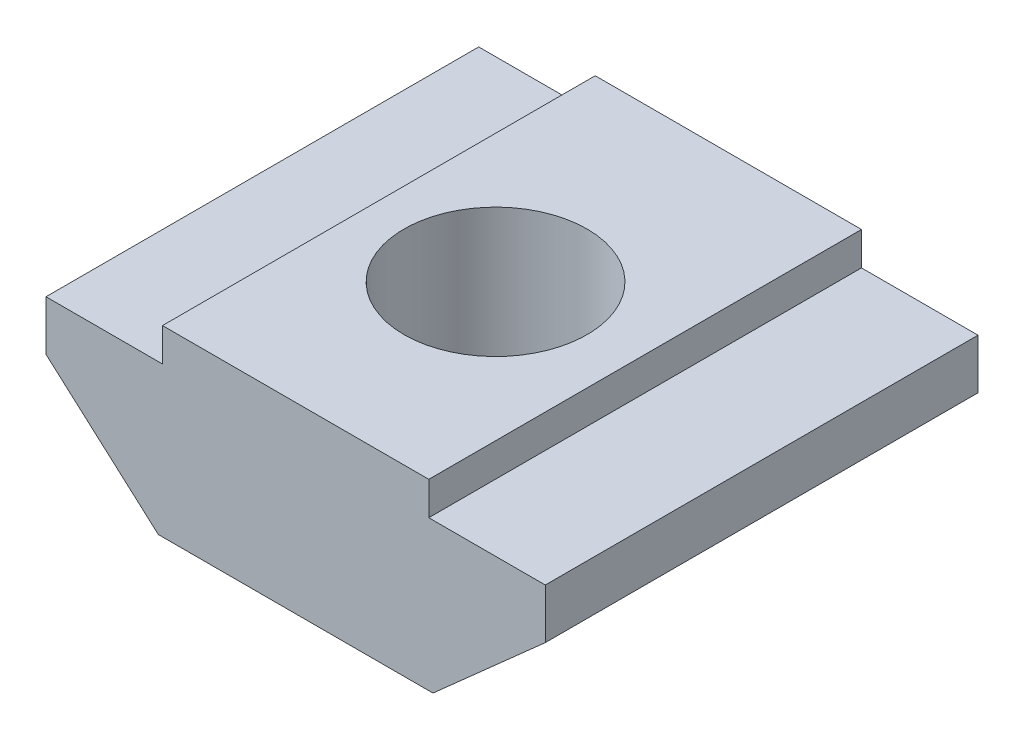
ISO-10303-21;
HEADER;
FILE_DESCRIPTION(('STEP AP214'),'2;1');
FILE_NAME('part.step','',(''),(''),'','','');
FILE_SCHEMA(('AUTOMOTIVE_DESIGN { 1 0 10303 214 1 1 1 1 }'));
ENDSEC;
DATA;
#1=APPLICATION_CONTEXT('core data for automotive mechanical design processes');
#2=APPLICATION_PROTOCOL_DEFINITION('international standard','automotive_design',2000,#1);
#3=PRODUCT_CONTEXT('',#1,'mechanical');
#4=PRODUCT('Part','Part','',(#3));
#5=PRODUCT_RELATED_PRODUCT_CATEGORY('part','',(#4));
#6=PRODUCT_DEFINITION_FORMATION('','',#4);
#7=PRODUCT_DEFINITION_CONTEXT('part definition',#1,'design');
#8=PRODUCT_DEFINITION('design','',#6,#7);
#9=PRODUCT_DEFINITION_SHAPE('','',#8);
#10=(LENGTH_UNIT() NAMED_UNIT(*) SI_UNIT(.MILLI.,.METRE.));
#11=(NAMED_UNIT(*) PLANE_ANGLE_UNIT() SI_UNIT($,.RADIAN.));
#12=(NAMED_UNIT(*) SI_UNIT($,.STERADIAN.) SOLID_ANGLE_UNIT());
#13=UNCERTAINTY_MEASURE_WITH_UNIT(LENGTH_MEASURE(1.E-05),#10,'distance_accuracy_value','');
#14=(GEOMETRIC_REPRESENTATION_CONTEXT(3) GLOBAL_UNCERTAINTY_ASSIGNED_CONTEXT((#13)) GLOBAL_UNIT_ASSIGNED_CONTEXT((#10,
#11,#12)) REPRESENTATION_CONTEXT('',''));
#15=CARTESIAN_POINT('',(0.,0.,0.));
#16=DIRECTION('',(0.,0.,1.));
#17=DIRECTION('',(1.,0.,0.));
#18=AXIS2_PLACEMENT_3D('',#15,#16,#17);
#19=CARTESIAN_POINT('',(-4.33688549496153,5.5,13.));
#20=DIRECTION('',(0.,-1.,0.));
#21=DIRECTION('',(0.,0.,-1.));
#22=AXIS2_PLACEMENT_3D('',#19,#20,#21);
#23=PLANE('',#22);
#24=DIRECTION('',(-1.,0.,0.));
#25=VECTOR('',#24,1.);
#26=CARTESIAN_POINT('',(-4.33688549496153,5.5,0.));
#27=LINE('',#26,#25);
#28=CARTESIAN_POINT('',(3.66311450503847,5.5,0.));
#29=VERTEX_POINT('',#28);
#30=CARTESIAN_POINT('',(-4.33688549496153,5.5,0.));
#31=VERTEX_POINT('',#30);
#32=EDGE_CURVE('E173',#29,#31,#27,.T.);
#33=ORIENTED_EDGE('',*,*,#32,.T.);
#34=DIRECTION('',(0.,0.,-1.));
#35=VECTOR('',#34,1.);
#36=CARTESIAN_POINT('',(-4.33688549496153,5.5,13.));
#37=LINE('',#36,#35);
#38=CARTESIAN_POINT('',(-4.33688549496153,5.5,13.));
#39=VERTEX_POINT('',#38);
#40=EDGE_CURVE('E142',#39,#31,#37,.T.);
#41=ORIENTED_EDGE('',*,*,#40,.F.);
#42=DIRECTION('',(-1.,0.,0.));
#43=VECTOR('',#42,1.);
#44=CARTESIAN_POINT('',(-4.33688549496153,5.5,13.));
#45=LINE('',#44,#43);
#46=CARTESIAN_POINT('',(3.66311450503847,5.5,13.));
#47=VERTEX_POINT('',#46);
#48=EDGE_CURVE('E131',#47,#39,#45,.T.);
#49=ORIENTED_EDGE('',*,*,#48,.F.);
#50=DIRECTION('',(0.,0.,-1.));
#51=VECTOR('',#50,1.);
#52=CARTESIAN_POINT('',(3.66311450503847,5.5,13.));
#53=LINE('',#52,#51);
#54=EDGE_CURVE('E189',#47,#29,#53,.T.);
#55=ORIENTED_EDGE('',*,*,#54,.T.);
#56=EDGE_LOOP('',(#33,#41,#49,#55));
#57=FACE_BOUND('',#56,.T.);
#58=CARTESIAN_POINT('',(-0.471799647864915,5.5,6.85919347099833));
#59=DIRECTION('',(0.,1.,0.));
#60=DIRECTION('',(0.,0.,1.));
#61=AXIS2_PLACEMENT_3D('',#58,#59,#60);
#62=CIRCLE('',#61,2.75);
#63=CARTESIAN_POINT('',(-0.471799647864915,5.5,9.60919347099833));
#64=VERTEX_POINT('',#63);
#65=EDGE_CURVE('E247',#64,#64,#62,.T.);
#66=ORIENTED_EDGE('',*,*,#65,.F.);
#67=EDGE_LOOP('',(#66));
#68=FACE_BOUND('',#67,.T.);
#69=ADVANCED_FACE('F39',(#57,#68),#23,.F.);
#70=CARTESIAN_POINT('',(-4.46188549496153,0.,13.));
#71=DIRECTION('',(0.66436383882992,0.74740931868366,0.));
#72=DIRECTION('',(-0.74740931868366,0.66436383882992,0.));
#73=AXIS2_PLACEMENT_3D('',#70,#71,#72);
#74=PLANE('',#73);
#75=DIRECTION('',(0.74740931868366,-0.66436383882992,0.));
#76=VECTOR('',#75,1.);
#77=CARTESIAN_POINT('',(-4.46188549496153,0.,0.));
#78=LINE('',#77,#76);
#79=CARTESIAN_POINT('',(-7.83688549496153,3.,0.));
#80=VERTEX_POINT('',#79);
#81=CARTESIAN_POINT('',(-4.46188549496153,0.,0.));
#82=VERTEX_POINT('',#81);
#83=EDGE_CURVE('E153',#80,#82,#78,.T.);
#84=ORIENTED_EDGE('',*,*,#83,.T.);
#85=DIRECTION('',(0.,0.,-1.));
#86=VECTOR('',#85,1.);
#87=CARTESIAN_POINT('',(-4.46188549496153,0.,13.));
#88=LINE('',#87,#86);
#89=CARTESIAN_POINT('',(-4.46188549496153,0.,13.));
#90=VERTEX_POINT('',#89);
#91=EDGE_CURVE('E11',#90,#82,#88,.T.);
#92=ORIENTED_EDGE('',*,*,#91,.F.);
#93=DIRECTION('',(0.74740931868366,-0.66436383882992,0.));
#94=VECTOR('',#93,1.);
#95=CARTESIAN_POINT('',(-4.46188549496153,0.,13.));
#96=LINE('',#95,#94);
#97=CARTESIAN_POINT('',(-7.83688549496153,3.,13.));
#98=VERTEX_POINT('',#97);
#99=EDGE_CURVE('E182',#98,#90,#96,.T.);
#100=ORIENTED_EDGE('',*,*,#99,.F.);
#101=DIRECTION('',(0.,0.,-1.));
#102=VECTOR('',#101,1.);
#103=CARTESIAN_POINT('',(-7.83688549496153,3.,13.));
#104=LINE('',#103,#102);
#105=EDGE_CURVE('E149',#98,#80,#104,.T.);
#106=ORIENTED_EDGE('',*,*,#105,.T.);
#107=EDGE_LOOP('',(#84,#92,#100,#106));
#108=FACE_BOUND('',#107,.T.);
#109=ADVANCED_FACE('F41',(#108),#74,.F.);
#110=CARTESIAN_POINT('',(-4.46188549496153,0.,13.));
#111=DIRECTION('',(0.,1.,0.));
#112=DIRECTION('',(0.,0.,1.));
#113=AXIS2_PLACEMENT_3D('',#110,#111,#112);
#114=PLANE('',#113);
#115=CARTESIAN_POINT('',(-0.471799647864915,0.,6.85919347099833));
#116=DIRECTION('',(0.,1.,0.));
#117=DIRECTION('',(0.,0.,1.));
#118=AXIS2_PLACEMENT_3D('',#115,#116,#117);
#119=CIRCLE('',#118,2.75);
#120=CARTESIAN_POINT('',(-0.471799647864915,0.,9.60919347099833));
#121=VERTEX_POINT('',#120);
#122=EDGE_CURVE('E158',#121,#121,#119,.T.);
#123=ORIENTED_EDGE('',*,*,#122,.T.);
#124=EDGE_LOOP('',(#123));
#125=FACE_BOUND('',#124,.T.);
#126=DIRECTION('',(1.,0.,0.));
#127=VECTOR('',#126,1.);
#128=CARTESIAN_POINT('',(-4.46188549496153,0.,0.));
#129=LINE('',#128,#127);
#130=CARTESIAN_POINT('',(3.78811450503847,0.,0.));
#131=VERTEX_POINT('',#130);
#132=EDGE_CURVE('E157',#82,#131,#129,.T.);
#133=ORIENTED_EDGE('',*,*,#132,.T.);
#134=DIRECTION('',(0.,0.,-1.));
#135=VECTOR('',#134,1.);
#136=CARTESIAN_POINT('',(3.78811450503847,0.,13.));
#137=LINE('',#136,#135);
#138=CARTESIAN_POINT('',(3.78811450503847,0.,13.));
#139=VERTEX_POINT('',#138);
#140=EDGE_CURVE('E49',#139,#131,#137,.T.);
#141=ORIENTED_EDGE('',*,*,#140,.F.);
#142=DIRECTION('',(1.,0.,0.));
#143=VECTOR('',#142,1.);
#144=CARTESIAN_POINT('',(-4.46188549496153,0.,13.));
#145=LINE('',#144,#143);
#146=EDGE_CURVE('E106',#90,#139,#145,.T.);
#147=ORIENTED_EDGE('',*,*,#146,.F.);
#148=ORIENTED_EDGE('',*,*,#91,.T.);
#149=EDGE_LOOP('',(#133,#141,#147,#148));
#150=FACE_BOUND('',#149,.T.);
#151=ADVANCED_FACE('F260',(#125,#150),#114,.F.);
#152=CARTESIAN_POINT('',(3.78811450503847,0.,13.));
#153=DIRECTION('',(-0.66436383882992,0.74740931868366,0.));
#154=DIRECTION('',(-0.74740931868366,-0.66436383882992,0.));
#155=AXIS2_PLACEMENT_3D('',#152,#153,#154);
#156=PLANE('',#155);
#157=DIRECTION('',(0.74740931868366,0.664363838829919,0.));
#158=VECTOR('',#157,1.);
#159=CARTESIAN_POINT('',(3.78811450503847,0.,0.));
#160=LINE('',#159,#158);
#161=CARTESIAN_POINT('',(7.16311450503847,3.,0.));
#162=VERTEX_POINT('',#161);
#163=EDGE_CURVE('E161',#131,#162,#160,.T.);
#164=ORIENTED_EDGE('',*,*,#163,.T.);
#165=DIRECTION('',(0.,0.,-1.));
#166=VECTOR('',#165,1.);
#167=CARTESIAN_POINT('',(7.16311450503847,3.,13.));
#168=LINE('',#167,#166);
#169=CARTESIAN_POINT('',(7.16311450503847,3.,13.));
#170=VERTEX_POINT('',#169);
#171=EDGE_CURVE('E201',#170,#162,#168,.T.);
#172=ORIENTED_EDGE('',*,*,#171,.F.);
#173=DIRECTION('',(0.74740931868366,0.664363838829919,0.));
#174=VECTOR('',#173,1.);
#175=CARTESIAN_POINT('',(3.78811450503847,0.,13.));
#176=LINE('',#175,#174);
#177=EDGE_CURVE('E211',#139,#170,#176,.T.);
#178=ORIENTED_EDGE('',*,*,#177,.F.);
#179=ORIENTED_EDGE('',*,*,#140,.T.);
#180=EDGE_LOOP('',(#164,#172,#178,#179));
#181=FACE_BOUND('',#180,.T.);
#182=ADVANCED_FACE('F209',(#181),#156,.F.);
#183=CARTESIAN_POINT('',(7.16311450503847,4.5,13.));
#184=DIRECTION('',(-1.,0.,0.));
#185=DIRECTION('',(0.,-1.,0.));
#186=AXIS2_PLACEMENT_3D('',#183,#184,#185);
#187=PLANE('',#186);
#188=DIRECTION('',(0.,1.,0.));
#189=VECTOR('',#188,1.);
#190=CARTESIAN_POINT('',(7.16311450503847,4.5,0.));
#191=LINE('',#190,#189);
#192=CARTESIAN_POINT('',(7.16311450503847,4.5,0.));
#193=VERTEX_POINT('',#192);
#194=EDGE_CURVE('E164',#162,#193,#191,.T.);
#195=ORIENTED_EDGE('',*,*,#194,.T.);
#196=DIRECTION('',(0.,0.,-1.));
#197=VECTOR('',#196,1.);
#198=CARTESIAN_POINT('',(7.16311450503847,4.5,13.));
#199=LINE('',#198,#197);
#200=CARTESIAN_POINT('',(7.16311450503847,4.5,13.));
#201=VERTEX_POINT('',#200);
#202=EDGE_CURVE('E197',#201,#193,#199,.T.);
#203=ORIENTED_EDGE('',*,*,#202,.F.);
#204=DIRECTION('',(0.,1.,0.));
#205=VECTOR('',#204,1.);
#206=CARTESIAN_POINT('',(7.16311450503847,4.5,13.));
#207=LINE('',#206,#205);
#208=EDGE_CURVE('E230',#170,#201,#207,.T.);
#209=ORIENTED_EDGE('',*,*,#208,.F.);
#210=ORIENTED_EDGE('',*,*,#171,.T.);
#211=EDGE_LOOP('',(#195,#203,#209,#210));
#212=FACE_BOUND('',#211,.T.);
#213=ADVANCED_FACE('F220',(#212),#187,.F.);
#214=CARTESIAN_POINT('',(3.66311450503847,4.5,13.));
#215=DIRECTION('',(0.,-1.,0.));
#216=DIRECTION('',(0.,0.,-1.));
#217=AXIS2_PLACEMENT_3D('',#214,#215,#216);
#218=PLANE('',#217);
#219=DIRECTION('',(-1.,0.,0.));
#220=VECTOR('',#219,1.);
#221=CARTESIAN_POINT('',(3.66311450503847,4.5,0.));
#222=LINE('',#221,#220);
#223=CARTESIAN_POINT('',(3.66311450503847,4.5,0.));
#224=VERTEX_POINT('',#223);
#225=EDGE_CURVE('E167',#193,#224,#222,.T.);
#226=ORIENTED_EDGE('',*,*,#225,.T.);
#227=DIRECTION('',(0.,0.,-1.));
#228=VECTOR('',#227,1.);
#229=CARTESIAN_POINT('',(3.66311450503847,4.5,13.));
#230=LINE('',#229,#228);
#231=CARTESIAN_POINT('',(3.66311450503847,4.5,13.));
#232=VERTEX_POINT('',#231);
#233=EDGE_CURVE('E193',#232,#224,#230,.T.);
#234=ORIENTED_EDGE('',*,*,#233,.F.);
#235=DIRECTION('',(-1.,0.,0.));
#236=VECTOR('',#235,1.);
#237=CARTESIAN_POINT('',(3.66311450503847,4.5,13.));
#238=LINE('',#237,#236);
#239=EDGE_CURVE('E226',#201,#232,#238,.T.);
#240=ORIENTED_EDGE('',*,*,#239,.F.);
#241=ORIENTED_EDGE('',*,*,#202,.T.);
#242=EDGE_LOOP('',(#226,#234,#240,#241));
#243=FACE_BOUND('',#242,.T.);
#244=ADVANCED_FACE('F224',(#243),#218,.F.);
#245=CARTESIAN_POINT('',(3.66311450503847,5.5,13.));
#246=DIRECTION('',(-1.,0.,0.));
#247=DIRECTION('',(0.,-1.,0.));
#248=AXIS2_PLACEMENT_3D('',#245,#246,#247);
#249=PLANE('',#248);
#250=DIRECTION('',(0.,1.,0.));
#251=VECTOR('',#250,1.);
#252=CARTESIAN_POINT('',(3.66311450503847,5.5,0.));
#253=LINE('',#252,#251);
#254=EDGE_CURVE('E170',#224,#29,#253,.T.);
#255=ORIENTED_EDGE('',*,*,#254,.T.);
#256=ORIENTED_EDGE('',*,*,#54,.F.);
#257=DIRECTION('',(0.,1.,0.));
#258=VECTOR('',#257,1.);
#259=CARTESIAN_POINT('',(3.66311450503847,5.5,13.));
#260=LINE('',#259,#258);
#261=EDGE_CURVE('E229',#232,#47,#260,.T.);
#262=ORIENTED_EDGE('',*,*,#261,.F.);
#263=ORIENTED_EDGE('',*,*,#233,.T.);
#264=EDGE_LOOP('',(#255,#256,#262,#263));
#265=FACE_BOUND('',#264,.T.);
#266=ADVANCED_FACE('F265',(#265),#249,.F.);
#267=CARTESIAN_POINT('',(-4.33688549496153,4.5,13.));
#268=DIRECTION('',(1.,0.,0.));
#269=DIRECTION('',(0.,0.,-1.));
#270=AXIS2_PLACEMENT_3D('',#267,#268,#269);
#271=PLANE('',#270);
#272=DIRECTION('',(0.,-1.,0.));
#273=VECTOR('',#272,1.);
#274=CARTESIAN_POINT('',(-4.33688549496153,4.5,0.));
#275=LINE('',#274,#273);
#276=CARTESIAN_POINT('',(-4.33688549496153,4.5,0.));
#277=VERTEX_POINT('',#276);
#278=EDGE_CURVE('E140',#31,#277,#275,.T.);
#279=ORIENTED_EDGE('',*,*,#278,.T.);
#280=DIRECTION('',(0.,0.,-1.));
#281=VECTOR('',#280,1.);
#282=CARTESIAN_POINT('',(-4.33688549496153,4.5,13.));
#283=LINE('',#282,#281);
#284=CARTESIAN_POINT('',(-4.33688549496153,4.5,13.));
#285=VERTEX_POINT('',#284);
#286=EDGE_CURVE('E137',#285,#277,#283,.T.);
#287=ORIENTED_EDGE('',*,*,#286,.F.);
#288=DIRECTION('',(0.,-1.,0.));
#289=VECTOR('',#288,1.);
#290=CARTESIAN_POINT('',(-4.33688549496153,4.5,13.));
#291=LINE('',#290,#289);
#292=EDGE_CURVE('E125',#39,#285,#291,.T.);
#293=ORIENTED_EDGE('',*,*,#292,.F.);
#294=ORIENTED_EDGE('',*,*,#40,.T.);
#295=EDGE_LOOP('',(#279,#287,#293,#294));
#296=FACE_BOUND('',#295,.T.);
#297=ADVANCED_FACE('F138',(#296),#271,.F.);
#298=CARTESIAN_POINT('',(-7.83688549496153,4.5,13.));
#299=DIRECTION('',(0.,-1.,0.));
#300=DIRECTION('',(0.,0.,-1.));
#301=AXIS2_PLACEMENT_3D('',#298,#299,#300);
#302=PLANE('',#301);
#303=DIRECTION('',(-1.,0.,0.));
#304=VECTOR('',#303,1.);
#305=CARTESIAN_POINT('',(-7.83688549496153,4.5,0.));
#306=LINE('',#305,#304);
#307=CARTESIAN_POINT('',(-7.83688549496153,4.5,0.));
#308=VERTEX_POINT('',#307);
#309=EDGE_CURVE('E92',#277,#308,#306,.T.);
#310=ORIENTED_EDGE('',*,*,#309,.T.);
#311=DIRECTION('',(0.,0.,-1.));
#312=VECTOR('',#311,1.);
#313=CARTESIAN_POINT('',(-7.83688549496153,4.5,13.));
#314=LINE('',#313,#312);
#315=CARTESIAN_POINT('',(-7.83688549496153,4.5,13.));
#316=VERTEX_POINT('',#315);
#317=EDGE_CURVE('E143',#316,#308,#314,.T.);
#318=ORIENTED_EDGE('',*,*,#317,.F.);
#319=DIRECTION('',(-1.,0.,0.));
#320=VECTOR('',#319,1.);
#321=CARTESIAN_POINT('',(-7.83688549496153,4.5,13.));
#322=LINE('',#321,#320);
#323=EDGE_CURVE('E129',#285,#316,#322,.T.);
#324=ORIENTED_EDGE('',*,*,#323,.F.);
#325=ORIENTED_EDGE('',*,*,#286,.T.);
#326=EDGE_LOOP('',(#310,#318,#324,#325));
#327=FACE_BOUND('',#326,.T.);
#328=ADVANCED_FACE('F145',(#327),#302,.F.);
#329=CARTESIAN_POINT('',(-7.83688549496153,3.,13.));
#330=DIRECTION('',(1.,0.,0.));
#331=DIRECTION('',(0.,0.,-1.));
#332=AXIS2_PLACEMENT_3D('',#329,#330,#331);
#333=PLANE('',#332);
#334=DIRECTION('',(0.,-1.,0.));
#335=VECTOR('',#334,1.);
#336=CARTESIAN_POINT('',(-7.83688549496153,3.,0.));
#337=LINE('',#336,#335);
#338=EDGE_CURVE('E98',#308,#80,#337,.T.);
#339=ORIENTED_EDGE('',*,*,#338,.T.);
#340=ORIENTED_EDGE('',*,*,#105,.F.);
#341=DIRECTION('',(0.,-1.,0.));
#342=VECTOR('',#341,1.);
#343=CARTESIAN_POINT('',(-7.83688549496153,3.,13.));
#344=LINE('',#343,#342);
#345=EDGE_CURVE('E57',#316,#98,#344,.T.);
#346=ORIENTED_EDGE('',*,*,#345,.F.);
#347=ORIENTED_EDGE('',*,*,#317,.T.);
#348=EDGE_LOOP('',(#339,#340,#346,#347));
#349=FACE_BOUND('',#348,.T.);
#350=ADVANCED_FACE('F283',(#349),#333,.F.);
#351=CARTESIAN_POINT('',(0.,0.,13.));
#352=DIRECTION('',(0.,0.,-1.));
#353=DIRECTION('',(-1.,0.,0.));
#354=AXIS2_PLACEMENT_3D('',#351,#352,#353);
#355=PLANE('',#354);
#356=ORIENTED_EDGE('',*,*,#99,.T.);
#357=ORIENTED_EDGE('',*,*,#146,.T.);
#358=ORIENTED_EDGE('',*,*,#177,.T.);
#359=ORIENTED_EDGE('',*,*,#208,.T.);
#360=ORIENTED_EDGE('',*,*,#239,.T.);
#361=ORIENTED_EDGE('',*,*,#261,.T.);
#362=ORIENTED_EDGE('',*,*,#48,.T.);
#363=ORIENTED_EDGE('',*,*,#292,.T.);
#364=ORIENTED_EDGE('',*,*,#323,.T.);
#365=ORIENTED_EDGE('',*,*,#345,.T.);
#366=EDGE_LOOP('',(#356,#357,#358,#359,#360,#361,#362,#363,#364,#365));
#367=FACE_BOUND('',#366,.T.);
#368=ADVANCED_FACE('F127',(#367),#355,.F.);
#369=CARTESIAN_POINT('',(0.,0.,0.));
#370=DIRECTION('',(0.,0.,-1.));
#371=DIRECTION('',(-1.,0.,0.));
#372=AXIS2_PLACEMENT_3D('',#369,#370,#371);
#373=PLANE('',#372);
#374=ORIENTED_EDGE('',*,*,#83,.F.);
#375=ORIENTED_EDGE('',*,*,#338,.F.);
#376=ORIENTED_EDGE('',*,*,#309,.F.);
#377=ORIENTED_EDGE('',*,*,#278,.F.);
#378=ORIENTED_EDGE('',*,*,#32,.F.);
#379=ORIENTED_EDGE('',*,*,#254,.F.);
#380=ORIENTED_EDGE('',*,*,#225,.F.);
#381=ORIENTED_EDGE('',*,*,#194,.F.);
#382=ORIENTED_EDGE('',*,*,#163,.F.);
#383=ORIENTED_EDGE('',*,*,#132,.F.);
#384=EDGE_LOOP('',(#374,#375,#376,#377,#378,#379,#380,#381,#382,#383));
#385=FACE_BOUND('',#384,.T.);
#386=ADVANCED_FACE('F215',(#385),#373,.T.);
#387=CARTESIAN_POINT('',(-0.471799647864915,5.5,6.85919347099833));
#388=DIRECTION('',(0.,1.,0.));
#389=DIRECTION('',(0.,0.,1.));
#390=AXIS2_PLACEMENT_3D('',#387,#388,#389);
#391=CYLINDRICAL_SURFACE('',#390,2.75);
#392=ORIENTED_EDGE('',*,*,#122,.F.);
#393=EDGE_LOOP('',(#392));
#394=FACE_BOUND('',#393,.T.);
#395=ORIENTED_EDGE('',*,*,#65,.T.);
#396=EDGE_LOOP('',(#395));
#397=FACE_BOUND('',#396,.T.);
#398=ADVANCED_FACE('F252',(#394,#397),#391,.F.);
#399=CLOSED_SHELL('',(#69,#109,#151,#182,#213,#244,#266,#297,#328,#350,#368,#386,#398));
#400=MANIFOLD_SOLID_BREP('B2',#399);
#401=ADVANCED_BREP_SHAPE_REPRESENTATION('',(#18,#400),#14);
#402=SHAPE_DEFINITION_REPRESENTATION(#9,#401);
ENDSEC;
END-ISO-10303-21;
